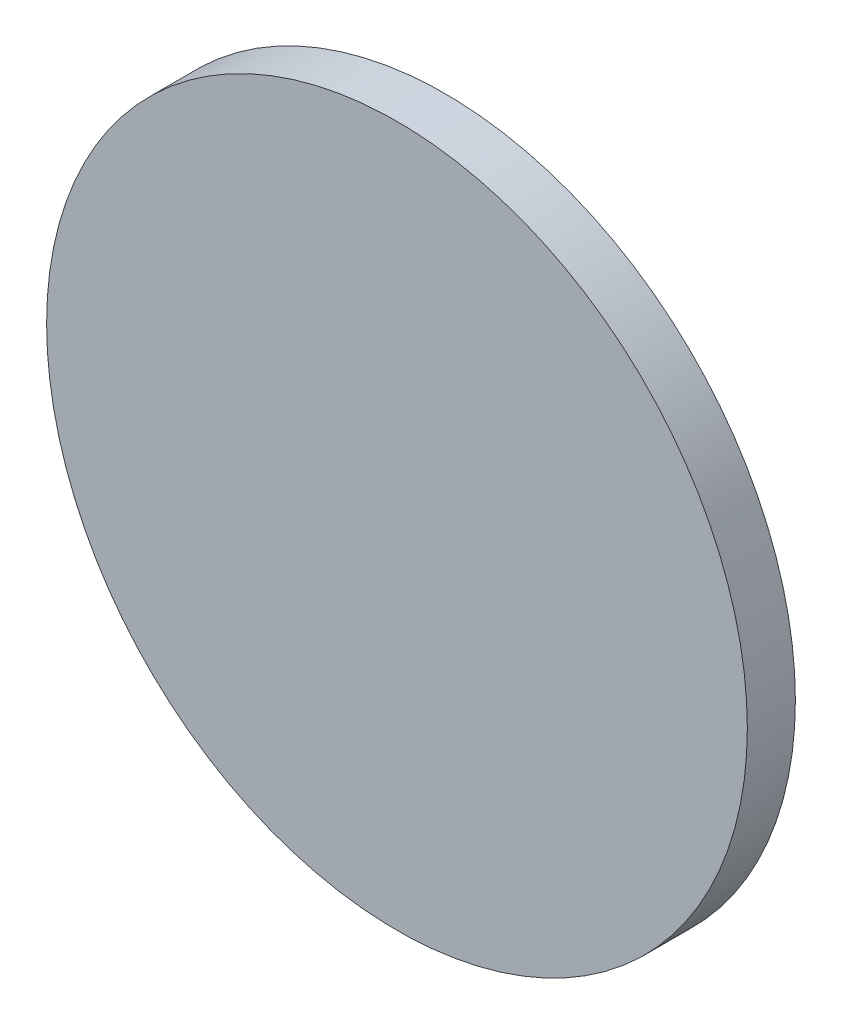
ISO-10303-21;
HEADER;
FILE_DESCRIPTION(('STEP AP214'),'2;1');
FILE_NAME('part.step','',(''),(''),'','','');
FILE_SCHEMA(('AUTOMOTIVE_DESIGN { 1 0 10303 214 1 1 1 1 }'));
ENDSEC;
DATA;
#1=APPLICATION_CONTEXT('core data for automotive mechanical design processes');
#2=APPLICATION_PROTOCOL_DEFINITION('international standard','automotive_design',2000,#1);
#3=PRODUCT_CONTEXT('',#1,'mechanical');
#4=PRODUCT('Part','Part','',(#3));
#5=PRODUCT_RELATED_PRODUCT_CATEGORY('part','',(#4));
#6=PRODUCT_DEFINITION_FORMATION('','',#4);
#7=PRODUCT_DEFINITION_CONTEXT('part definition',#1,'design');
#8=PRODUCT_DEFINITION('design','',#6,#7);
#9=PRODUCT_DEFINITION_SHAPE('','',#8);
#10=(LENGTH_UNIT() NAMED_UNIT(*) SI_UNIT(.MILLI.,.METRE.));
#11=(NAMED_UNIT(*) PLANE_ANGLE_UNIT() SI_UNIT($,.RADIAN.));
#12=(NAMED_UNIT(*) SI_UNIT($,.STERADIAN.) SOLID_ANGLE_UNIT());
#13=UNCERTAINTY_MEASURE_WITH_UNIT(LENGTH_MEASURE(1.E-05),#10,'distance_accuracy_value','');
#14=(GEOMETRIC_REPRESENTATION_CONTEXT(3) GLOBAL_UNCERTAINTY_ASSIGNED_CONTEXT((#13)) GLOBAL_UNIT_ASSIGNED_CONTEXT((#10,
#11,#12)) REPRESENTATION_CONTEXT('',''));
#15=CARTESIAN_POINT('',(0.,0.,0.));
#16=DIRECTION('',(0.,0.,1.));
#17=DIRECTION('',(1.,0.,0.));
#18=AXIS2_PLACEMENT_3D('',#15,#16,#17);
#19=CARTESIAN_POINT('',(0.,0.,2.4));
#20=DIRECTION('',(0.,0.,-1.));
#21=DIRECTION('',(-1.,0.,0.));
#22=AXIS2_PLACEMENT_3D('',#19,#20,#21);
#23=CYLINDRICAL_SURFACE('',#22,17.5);
#24=CARTESIAN_POINT('',(0.,0.,2.4));
#25=DIRECTION('',(0.,0.,1.));
#26=DIRECTION('',(1.,0.,0.));
#27=AXIS2_PLACEMENT_3D('',#24,#25,#26);
#28=CIRCLE('',#27,17.5);
#29=CARTESIAN_POINT('',(17.5,0.,2.4));
#30=VERTEX_POINT('',#29);
#31=EDGE_CURVE('E10',#30,#30,#28,.T.);
#32=ORIENTED_EDGE('',*,*,#31,.F.);
#33=EDGE_LOOP('',(#32));
#34=FACE_BOUND('',#33,.T.);
#35=CARTESIAN_POINT('',(0.,0.,0.));
#36=DIRECTION('',(0.,0.,1.));
#37=DIRECTION('',(1.,0.,0.));
#38=AXIS2_PLACEMENT_3D('',#35,#36,#37);
#39=CIRCLE('',#38,17.5);
#40=CARTESIAN_POINT('',(17.5,0.,0.));
#41=VERTEX_POINT('',#40);
#42=EDGE_CURVE('E34',#41,#41,#39,.T.);
#43=ORIENTED_EDGE('',*,*,#42,.T.);
#44=EDGE_LOOP('',(#43));
#45=FACE_BOUND('',#44,.T.);
#46=ADVANCED_FACE('F31',(#34,#45),#23,.T.);
#47=CARTESIAN_POINT('',(0.,0.,2.4));
#48=DIRECTION('',(0.,0.,1.));
#49=DIRECTION('',(1.,0.,0.));
#50=AXIS2_PLACEMENT_3D('',#47,#48,#49);
#51=PLANE('',#50);
#52=ORIENTED_EDGE('',*,*,#31,.T.);
#53=EDGE_LOOP('',(#52));
#54=FACE_BOUND('',#53,.T.);
#55=ADVANCED_FACE('F46',(#54),#51,.T.);
#56=CARTESIAN_POINT('',(0.,0.,0.));
#57=DIRECTION('',(0.,0.,1.));
#58=DIRECTION('',(1.,0.,0.));
#59=AXIS2_PLACEMENT_3D('',#56,#57,#58);
#60=PLANE('',#59);
#61=ORIENTED_EDGE('',*,*,#42,.F.);
#62=EDGE_LOOP('',(#61));
#63=FACE_BOUND('',#62,.T.);
#64=ADVANCED_FACE('F44',(#63),#60,.F.);
#65=CLOSED_SHELL('',(#46,#55,#64));
#66=MANIFOLD_SOLID_BREP('B2',#65);
#67=ADVANCED_BREP_SHAPE_REPRESENTATION('',(#18,#66),#14);
#68=SHAPE_DEFINITION_REPRESENTATION(#9,#67);
ENDSEC;
END-ISO-10303-21;
